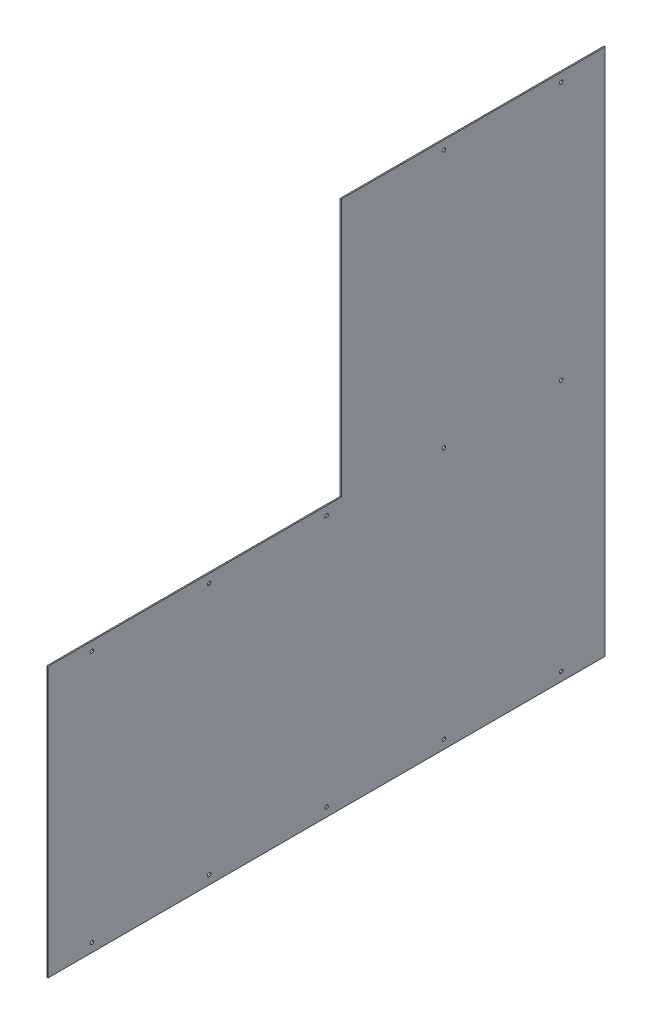
ISO-10303-21;
HEADER;
FILE_DESCRIPTION(('STEP AP214'),'2;1');
FILE_NAME('part.step','',(''),(''),'','','');
FILE_SCHEMA(('AUTOMOTIVE_DESIGN { 1 0 10303 214 1 1 1 1 }'));
ENDSEC;
DATA;
#1=APPLICATION_CONTEXT('core data for automotive mechanical design processes');
#2=APPLICATION_PROTOCOL_DEFINITION('international standard','automotive_design',2000,#1);
#3=PRODUCT_CONTEXT('',#1,'mechanical');
#4=PRODUCT('Part','Part','',(#3));
#5=PRODUCT_RELATED_PRODUCT_CATEGORY('part','',(#4));
#6=PRODUCT_DEFINITION_FORMATION('','',#4);
#7=PRODUCT_DEFINITION_CONTEXT('part definition',#1,'design');
#8=PRODUCT_DEFINITION('design','',#6,#7);
#9=PRODUCT_DEFINITION_SHAPE('','',#8);
#10=(LENGTH_UNIT() NAMED_UNIT(*) SI_UNIT(.MILLI.,.METRE.));
#11=(NAMED_UNIT(*) PLANE_ANGLE_UNIT() SI_UNIT($,.RADIAN.));
#12=(NAMED_UNIT(*) SI_UNIT($,.STERADIAN.) SOLID_ANGLE_UNIT());
#13=UNCERTAINTY_MEASURE_WITH_UNIT(LENGTH_MEASURE(1.E-05),#10,'distance_accuracy_value','');
#14=(GEOMETRIC_REPRESENTATION_CONTEXT(3) GLOBAL_UNCERTAINTY_ASSIGNED_CONTEXT((#13)) GLOBAL_UNIT_ASSIGNED_CONTEXT((#10,
#11,#12)) REPRESENTATION_CONTEXT('',''));
#15=CARTESIAN_POINT('',(0.,0.,0.));
#16=DIRECTION('',(0.,0.,1.));
#17=DIRECTION('',(1.,0.,0.));
#18=AXIS2_PLACEMENT_3D('',#15,#16,#17);
#19=CARTESIAN_POINT('',(2.,230.,475.));
#20=DIRECTION('',(0.,-1.,0.));
#21=DIRECTION('',(0.,0.,-1.));
#22=AXIS2_PLACEMENT_3D('',#19,#20,#21);
#23=PLANE('',#22);
#24=DIRECTION('',(1.,0.,0.));
#25=VECTOR('',#24,1.);
#26=CARTESIAN_POINT('',(0.,230.,-25.));
#27=LINE('',#26,#25);
#28=CARTESIAN_POINT('',(0.,230.,-24.9999999999999));
#29=VERTEX_POINT('',#28);
#30=CARTESIAN_POINT('',(2.,230.,-25.));
#31=VERTEX_POINT('',#30);
#32=EDGE_CURVE('E55',#29,#31,#27,.T.);
#33=ORIENTED_EDGE('',*,*,#32,.F.);
#34=DIRECTION('',(0.,0.,1.));
#35=VECTOR('',#34,1.);
#36=CARTESIAN_POINT('',(0.,230.,475.));
#37=LINE('',#36,#35);
#38=CARTESIAN_POINT('',(0.,230.,475.));
#39=VERTEX_POINT('',#38);
#40=EDGE_CURVE('E110',#29,#39,#37,.T.);
#41=ORIENTED_EDGE('',*,*,#40,.T.);
#42=DIRECTION('',(-1.,0.,0.));
#43=VECTOR('',#42,1.);
#44=CARTESIAN_POINT('',(2.,230.,475.));
#45=LINE('',#44,#43);
#46=CARTESIAN_POINT('',(2.,230.,475.));
#47=VERTEX_POINT('',#46);
#48=EDGE_CURVE('E11',#47,#39,#45,.T.);
#49=ORIENTED_EDGE('',*,*,#48,.F.);
#50=DIRECTION('',(0.,0.,1.));
#51=VECTOR('',#50,1.);
#52=CARTESIAN_POINT('',(2.,230.,475.));
#53=LINE('',#52,#51);
#54=EDGE_CURVE('E84',#31,#47,#53,.T.);
#55=ORIENTED_EDGE('',*,*,#54,.F.);
#56=EDGE_LOOP('',(#33,#41,#49,#55));
#57=FACE_BOUND('',#56,.T.);
#58=ADVANCED_FACE('F39',(#57),#23,.F.);
#59=CARTESIAN_POINT('',(2.,-230.,-475.));
#60=DIRECTION('',(0.,0.,1.));
#61=DIRECTION('',(1.,0.,0.));
#62=AXIS2_PLACEMENT_3D('',#59,#60,#61);
#63=PLANE('',#62);
#64=DIRECTION('',(0.,1.,0.));
#65=VECTOR('',#64,1.);
#66=CARTESIAN_POINT('',(0.,-230.,-475.));
#67=LINE('',#66,#65);
#68=CARTESIAN_POINT('',(0.,-230.,-475.));
#69=VERTEX_POINT('',#68);
#70=CARTESIAN_POINT('',(0.,670.,-475.));
#71=VERTEX_POINT('',#70);
#72=EDGE_CURVE('E101',#69,#71,#67,.T.);
#73=ORIENTED_EDGE('',*,*,#72,.T.);
#74=DIRECTION('',(1.,0.,0.));
#75=VECTOR('',#74,1.);
#76=CARTESIAN_POINT('',(0.,670.,-475.));
#77=LINE('',#76,#75);
#78=CARTESIAN_POINT('',(2.,670.,-475.));
#79=VERTEX_POINT('',#78);
#80=EDGE_CURVE('E104',#71,#79,#77,.T.);
#81=ORIENTED_EDGE('',*,*,#80,.T.);
#82=DIRECTION('',(0.,1.,0.));
#83=VECTOR('',#82,1.);
#84=CARTESIAN_POINT('',(2.,-230.,-475.));
#85=LINE('',#84,#83);
#86=CARTESIAN_POINT('',(2.,-230.,-475.));
#87=VERTEX_POINT('',#86);
#88=EDGE_CURVE('E224',#87,#79,#85,.T.);
#89=ORIENTED_EDGE('',*,*,#88,.F.);
#90=DIRECTION('',(-1.,0.,0.));
#91=VECTOR('',#90,1.);
#92=CARTESIAN_POINT('',(2.,-230.,-475.));
#93=LINE('',#92,#91);
#94=EDGE_CURVE('E106',#87,#69,#93,.T.);
#95=ORIENTED_EDGE('',*,*,#94,.T.);
#96=EDGE_LOOP('',(#73,#81,#89,#95));
#97=FACE_BOUND('',#96,.T.);
#98=ADVANCED_FACE('F41',(#97),#63,.F.);
#99=CARTESIAN_POINT('',(2.,-230.,475.));
#100=DIRECTION('',(0.,0.,-1.));
#101=DIRECTION('',(-1.,0.,0.));
#102=AXIS2_PLACEMENT_3D('',#99,#100,#101);
#103=PLANE('',#102);
#104=DIRECTION('',(0.,-1.,0.));
#105=VECTOR('',#104,1.);
#106=CARTESIAN_POINT('',(0.,-230.,475.));
#107=LINE('',#106,#105);
#108=CARTESIAN_POINT('',(0.,-230.,475.));
#109=VERTEX_POINT('',#108);
#110=EDGE_CURVE('E236',#39,#109,#107,.T.);
#111=ORIENTED_EDGE('',*,*,#110,.T.);
#112=DIRECTION('',(-1.,0.,0.));
#113=VECTOR('',#112,1.);
#114=CARTESIAN_POINT('',(2.,-230.,475.));
#115=LINE('',#114,#113);
#116=CARTESIAN_POINT('',(2.,-230.,475.));
#117=VERTEX_POINT('',#116);
#118=EDGE_CURVE('E48',#117,#109,#115,.T.);
#119=ORIENTED_EDGE('',*,*,#118,.F.);
#120=DIRECTION('',(0.,-1.,0.));
#121=VECTOR('',#120,1.);
#122=CARTESIAN_POINT('',(2.,-230.,475.));
#123=LINE('',#122,#121);
#124=EDGE_CURVE('E229',#47,#117,#123,.T.);
#125=ORIENTED_EDGE('',*,*,#124,.F.);
#126=ORIENTED_EDGE('',*,*,#48,.T.);
#127=EDGE_LOOP('',(#111,#119,#125,#126));
#128=FACE_BOUND('',#127,.T.);
#129=ADVANCED_FACE('F248',(#128),#103,.F.);
#130=CARTESIAN_POINT('',(2.,-230.,475.));
#131=DIRECTION('',(0.,1.,0.));
#132=DIRECTION('',(0.,0.,1.));
#133=AXIS2_PLACEMENT_3D('',#130,#131,#132);
#134=PLANE('',#133);
#135=DIRECTION('',(0.,0.,-1.));
#136=VECTOR('',#135,1.);
#137=CARTESIAN_POINT('',(0.,-230.,475.));
#138=LINE('',#137,#136);
#139=EDGE_CURVE('E80',#109,#69,#138,.T.);
#140=ORIENTED_EDGE('',*,*,#139,.T.);
#141=ORIENTED_EDGE('',*,*,#94,.F.);
#142=DIRECTION('',(0.,0.,-1.));
#143=VECTOR('',#142,1.);
#144=CARTESIAN_POINT('',(2.,-230.,475.));
#145=LINE('',#144,#143);
#146=EDGE_CURVE('E64',#117,#87,#145,.T.);
#147=ORIENTED_EDGE('',*,*,#146,.F.);
#148=ORIENTED_EDGE('',*,*,#118,.T.);
#149=EDGE_LOOP('',(#140,#141,#147,#148));
#150=FACE_BOUND('',#149,.T.);
#151=ADVANCED_FACE('F244',(#150),#134,.F.);
#152=CARTESIAN_POINT('',(2.,0.,0.));
#153=DIRECTION('',(-1.,0.,0.));
#154=DIRECTION('',(0.,0.,1.));
#155=AXIS2_PLACEMENT_3D('',#152,#153,#154);
#156=PLANE('',#155);
#157=CARTESIAN_POINT('',(2.,-215.,400.));
#158=DIRECTION('',(1.,0.,0.));
#159=DIRECTION('',(0.,0.,1.));
#160=AXIS2_PLACEMENT_3D('',#157,#158,#159);
#161=CIRCLE('',#160,2.99999999999999);
#162=CARTESIAN_POINT('',(2.,-215.,403.));
#163=VERTEX_POINT('',#162);
#164=EDGE_CURVE('E143',#163,#163,#161,.T.);
#165=ORIENTED_EDGE('',*,*,#164,.F.);
#166=EDGE_LOOP('',(#165));
#167=FACE_BOUND('',#166,.T.);
#168=CARTESIAN_POINT('',(2.,-215.,-400.));
#169=DIRECTION('',(1.,0.,0.));
#170=DIRECTION('',(0.,0.,1.));
#171=AXIS2_PLACEMENT_3D('',#168,#169,#170);
#172=CIRCLE('',#171,2.99999999999999);
#173=CARTESIAN_POINT('',(2.,-215.,-397.));
#174=VERTEX_POINT('',#173);
#175=EDGE_CURVE('E201',#174,#174,#172,.T.);
#176=ORIENTED_EDGE('',*,*,#175,.F.);
#177=EDGE_LOOP('',(#176));
#178=FACE_BOUND('',#177,.T.);
#179=CARTESIAN_POINT('',(2.,-215.,1.11022302462516E-13));
#180=DIRECTION('',(1.,0.,0.));
#181=DIRECTION('',(0.,0.,1.));
#182=AXIS2_PLACEMENT_3D('',#179,#180,#181);
#183=CIRCLE('',#182,3.);
#184=CARTESIAN_POINT('',(2.,-215.,3.00000000000011));
#185=VERTEX_POINT('',#184);
#186=EDGE_CURVE('E184',#185,#185,#183,.T.);
#187=ORIENTED_EDGE('',*,*,#186,.F.);
#188=EDGE_LOOP('',(#187));
#189=FACE_BOUND('',#188,.T.);
#190=CARTESIAN_POINT('',(2.,-215.,-200.));
#191=DIRECTION('',(1.,0.,0.));
#192=DIRECTION('',(0.,0.,1.));
#193=AXIS2_PLACEMENT_3D('',#190,#191,#192);
#194=CIRCLE('',#193,2.99999999999999);
#195=CARTESIAN_POINT('',(2.,-215.,-197.));
#196=VERTEX_POINT('',#195);
#197=EDGE_CURVE('E185',#196,#196,#194,.T.);
#198=ORIENTED_EDGE('',*,*,#197,.F.);
#199=EDGE_LOOP('',(#198));
#200=FACE_BOUND('',#199,.T.);
#201=CARTESIAN_POINT('',(2.,-215.,200.));
#202=DIRECTION('',(1.,0.,0.));
#203=DIRECTION('',(0.,0.,1.));
#204=AXIS2_PLACEMENT_3D('',#201,#202,#203);
#205=CIRCLE('',#204,2.99999999999999);
#206=CARTESIAN_POINT('',(2.,-215.,203.));
#207=VERTEX_POINT('',#206);
#208=EDGE_CURVE('E193',#207,#207,#205,.T.);
#209=ORIENTED_EDGE('',*,*,#208,.F.);
#210=EDGE_LOOP('',(#209));
#211=FACE_BOUND('',#210,.T.);
#212=CARTESIAN_POINT('',(2.,215.,-400.));
#213=DIRECTION('',(1.,0.,0.));
#214=DIRECTION('',(0.,0.,-1.));
#215=AXIS2_PLACEMENT_3D('',#212,#213,#214);
#216=CIRCLE('',#215,2.99999999999999);
#217=CARTESIAN_POINT('',(2.,215.,-403.));
#218=VERTEX_POINT('',#217);
#219=EDGE_CURVE('E175',#218,#218,#216,.T.);
#220=ORIENTED_EDGE('',*,*,#219,.F.);
#221=EDGE_LOOP('',(#220));
#222=FACE_BOUND('',#221,.T.);
#223=CARTESIAN_POINT('',(2.,215.,-200.));
#224=DIRECTION('',(1.,0.,0.));
#225=DIRECTION('',(0.,0.,-1.));
#226=AXIS2_PLACEMENT_3D('',#223,#224,#225);
#227=CIRCLE('',#226,2.99999999999999);
#228=CARTESIAN_POINT('',(2.,215.,-203.));
#229=VERTEX_POINT('',#228);
#230=EDGE_CURVE('E167',#229,#229,#227,.T.);
#231=ORIENTED_EDGE('',*,*,#230,.F.);
#232=EDGE_LOOP('',(#231));
#233=FACE_BOUND('',#232,.T.);
#234=CARTESIAN_POINT('',(2.,215.,-1.11022302462516E-13));
#235=DIRECTION('',(1.,0.,0.));
#236=DIRECTION('',(0.,0.,-1.));
#237=AXIS2_PLACEMENT_3D('',#234,#235,#236);
#238=CIRCLE('',#237,3.);
#239=CARTESIAN_POINT('',(2.,215.,-3.00000000000011));
#240=VERTEX_POINT('',#239);
#241=EDGE_CURVE('E159',#240,#240,#238,.T.);
#242=ORIENTED_EDGE('',*,*,#241,.F.);
#243=EDGE_LOOP('',(#242));
#244=FACE_BOUND('',#243,.T.);
#245=CARTESIAN_POINT('',(2.,215.,200.));
#246=DIRECTION('',(1.,0.,0.));
#247=DIRECTION('',(0.,0.,-1.));
#248=AXIS2_PLACEMENT_3D('',#245,#246,#247);
#249=CIRCLE('',#248,2.99999999999999);
#250=CARTESIAN_POINT('',(2.,215.,197.));
#251=VERTEX_POINT('',#250);
#252=EDGE_CURVE('E151',#251,#251,#249,.T.);
#253=ORIENTED_EDGE('',*,*,#252,.F.);
#254=EDGE_LOOP('',(#253));
#255=FACE_BOUND('',#254,.T.);
#256=CARTESIAN_POINT('',(2.,215.,400.));
#257=DIRECTION('',(1.,0.,0.));
#258=DIRECTION('',(0.,0.,-1.));
#259=AXIS2_PLACEMENT_3D('',#256,#257,#258);
#260=CIRCLE('',#259,2.99999999999999);
#261=CARTESIAN_POINT('',(2.,215.,397.));
#262=VERTEX_POINT('',#261);
#263=EDGE_CURVE('E150',#262,#262,#260,.T.);
#264=ORIENTED_EDGE('',*,*,#263,.F.);
#265=EDGE_LOOP('',(#264));
#266=FACE_BOUND('',#265,.T.);
#267=ORIENTED_EDGE('',*,*,#88,.T.);
#268=DIRECTION('',(0.,0.,1.));
#269=VECTOR('',#268,1.);
#270=CARTESIAN_POINT('',(2.,670.,-25.));
#271=LINE('',#270,#269);
#272=CARTESIAN_POINT('',(2.,670.,-25.));
#273=VERTEX_POINT('',#272);
#274=EDGE_CURVE('E118',#79,#273,#271,.T.);
#275=ORIENTED_EDGE('',*,*,#274,.T.);
#276=DIRECTION('',(0.,-1.,0.));
#277=VECTOR('',#276,1.);
#278=CARTESIAN_POINT('',(2.,230.,-25.));
#279=LINE('',#278,#277);
#280=EDGE_CURVE('E128',#273,#31,#279,.T.);
#281=ORIENTED_EDGE('',*,*,#280,.T.);
#282=ORIENTED_EDGE('',*,*,#54,.T.);
#283=ORIENTED_EDGE('',*,*,#124,.T.);
#284=ORIENTED_EDGE('',*,*,#146,.T.);
#285=EDGE_LOOP('',(#267,#275,#281,#282,#283,#284));
#286=FACE_BOUND('',#285,.T.);
#287=CARTESIAN_POINT('',(2.,655.,-200.));
#288=DIRECTION('',(1.,0.,0.));
#289=DIRECTION('',(0.,0.,-1.));
#290=AXIS2_PLACEMENT_3D('',#287,#288,#289);
#291=CIRCLE('',#290,2.99999999999999);
#292=CARTESIAN_POINT('',(2.,655.,-203.));
#293=VERTEX_POINT('',#292);
#294=EDGE_CURVE('E260',#293,#293,#291,.T.);
#295=ORIENTED_EDGE('',*,*,#294,.F.);
#296=EDGE_LOOP('',(#295));
#297=FACE_BOUND('',#296,.T.);
#298=CARTESIAN_POINT('',(2.,655.,-400.));
#299=DIRECTION('',(1.,0.,0.));
#300=DIRECTION('',(0.,0.,-1.));
#301=AXIS2_PLACEMENT_3D('',#298,#299,#300);
#302=CIRCLE('',#301,2.99999999999999);
#303=CARTESIAN_POINT('',(2.,655.,-403.));
#304=VERTEX_POINT('',#303);
#305=EDGE_CURVE('E135',#304,#304,#302,.T.);
#306=ORIENTED_EDGE('',*,*,#305,.F.);
#307=EDGE_LOOP('',(#306));
#308=FACE_BOUND('',#307,.T.);
#309=ADVANCED_FACE('F252',(#167,#178,#189,#200,#211,#222,#233,#244,#255,#266,#286,#297,#308),
#156,.F.);
#310=CARTESIAN_POINT('',(0.,0.,0.));
#311=DIRECTION('',(-1.,0.,0.));
#312=DIRECTION('',(0.,0.,1.));
#313=AXIS2_PLACEMENT_3D('',#310,#311,#312);
#314=PLANE('',#313);
#315=CARTESIAN_POINT('',(0.,-215.,400.));
#316=DIRECTION('',(1.,0.,0.));
#317=DIRECTION('',(0.,0.,1.));
#318=AXIS2_PLACEMENT_3D('',#315,#316,#317);
#319=CIRCLE('',#318,2.99999999999999);
#320=CARTESIAN_POINT('',(0.,-215.,403.));
#321=VERTEX_POINT('',#320);
#322=EDGE_CURVE('E197',#321,#321,#319,.T.);
#323=ORIENTED_EDGE('',*,*,#322,.T.);
#324=EDGE_LOOP('',(#323));
#325=FACE_BOUND('',#324,.T.);
#326=CARTESIAN_POINT('',(0.,-215.,-400.));
#327=DIRECTION('',(1.,0.,0.));
#328=DIRECTION('',(0.,0.,1.));
#329=AXIS2_PLACEMENT_3D('',#326,#327,#328);
#330=CIRCLE('',#329,2.99999999999999);
#331=CARTESIAN_POINT('',(0.,-215.,-397.));
#332=VERTEX_POINT('',#331);
#333=EDGE_CURVE('E179',#332,#332,#330,.T.);
#334=ORIENTED_EDGE('',*,*,#333,.T.);
#335=EDGE_LOOP('',(#334));
#336=FACE_BOUND('',#335,.T.);
#337=CARTESIAN_POINT('',(0.,-215.,1.11022302462516E-13));
#338=DIRECTION('',(1.,0.,0.));
#339=DIRECTION('',(0.,0.,1.));
#340=AXIS2_PLACEMENT_3D('',#337,#338,#339);
#341=CIRCLE('',#340,3.);
#342=CARTESIAN_POINT('',(0.,-215.,3.00000000000011));
#343=VERTEX_POINT('',#342);
#344=EDGE_CURVE('E205',#343,#343,#341,.T.);
#345=ORIENTED_EDGE('',*,*,#344,.T.);
#346=EDGE_LOOP('',(#345));
#347=FACE_BOUND('',#346,.T.);
#348=CARTESIAN_POINT('',(0.,-215.,-200.));
#349=DIRECTION('',(1.,0.,0.));
#350=DIRECTION('',(0.,0.,1.));
#351=AXIS2_PLACEMENT_3D('',#348,#349,#350);
#352=CIRCLE('',#351,2.99999999999999);
#353=CARTESIAN_POINT('',(0.,-215.,-197.));
#354=VERTEX_POINT('',#353);
#355=EDGE_CURVE('E180',#354,#354,#352,.T.);
#356=ORIENTED_EDGE('',*,*,#355,.T.);
#357=EDGE_LOOP('',(#356));
#358=FACE_BOUND('',#357,.T.);
#359=CARTESIAN_POINT('',(0.,-215.,200.));
#360=DIRECTION('',(1.,0.,0.));
#361=DIRECTION('',(0.,0.,1.));
#362=AXIS2_PLACEMENT_3D('',#359,#360,#361);
#363=CIRCLE('',#362,2.99999999999999);
#364=CARTESIAN_POINT('',(0.,-215.,203.));
#365=VERTEX_POINT('',#364);
#366=EDGE_CURVE('E189',#365,#365,#363,.T.);
#367=ORIENTED_EDGE('',*,*,#366,.T.);
#368=EDGE_LOOP('',(#367));
#369=FACE_BOUND('',#368,.T.);
#370=CARTESIAN_POINT('',(0.,215.,-400.));
#371=DIRECTION('',(1.,0.,0.));
#372=DIRECTION('',(0.,0.,-1.));
#373=AXIS2_PLACEMENT_3D('',#370,#371,#372);
#374=CIRCLE('',#373,2.99999999999999);
#375=CARTESIAN_POINT('',(0.,215.,-403.));
#376=VERTEX_POINT('',#375);
#377=EDGE_CURVE('E171',#376,#376,#374,.T.);
#378=ORIENTED_EDGE('',*,*,#377,.T.);
#379=EDGE_LOOP('',(#378));
#380=FACE_BOUND('',#379,.T.);
#381=CARTESIAN_POINT('',(0.,215.,-200.));
#382=DIRECTION('',(1.,0.,0.));
#383=DIRECTION('',(0.,0.,-1.));
#384=AXIS2_PLACEMENT_3D('',#381,#382,#383);
#385=CIRCLE('',#384,2.99999999999999);
#386=CARTESIAN_POINT('',(0.,215.,-203.));
#387=VERTEX_POINT('',#386);
#388=EDGE_CURVE('E163',#387,#387,#385,.T.);
#389=ORIENTED_EDGE('',*,*,#388,.T.);
#390=EDGE_LOOP('',(#389));
#391=FACE_BOUND('',#390,.T.);
#392=CARTESIAN_POINT('',(0.,215.,-1.11022302462516E-13));
#393=DIRECTION('',(1.,0.,0.));
#394=DIRECTION('',(0.,0.,-1.));
#395=AXIS2_PLACEMENT_3D('',#392,#393,#394);
#396=CIRCLE('',#395,3.);
#397=CARTESIAN_POINT('',(0.,215.,-3.00000000000011));
#398=VERTEX_POINT('',#397);
#399=EDGE_CURVE('E155',#398,#398,#396,.T.);
#400=ORIENTED_EDGE('',*,*,#399,.T.);
#401=EDGE_LOOP('',(#400));
#402=FACE_BOUND('',#401,.T.);
#403=CARTESIAN_POINT('',(0.,215.,200.));
#404=DIRECTION('',(1.,0.,0.));
#405=DIRECTION('',(0.,0.,-1.));
#406=AXIS2_PLACEMENT_3D('',#403,#404,#405);
#407=CIRCLE('',#406,2.99999999999999);
#408=CARTESIAN_POINT('',(0.,215.,197.));
#409=VERTEX_POINT('',#408);
#410=EDGE_CURVE('E146',#409,#409,#407,.T.);
#411=ORIENTED_EDGE('',*,*,#410,.T.);
#412=EDGE_LOOP('',(#411));
#413=FACE_BOUND('',#412,.T.);
#414=CARTESIAN_POINT('',(0.,215.,400.));
#415=DIRECTION('',(1.,0.,0.));
#416=DIRECTION('',(0.,0.,-1.));
#417=AXIS2_PLACEMENT_3D('',#414,#415,#416);
#418=CIRCLE('',#417,2.99999999999999);
#419=CARTESIAN_POINT('',(0.,215.,397.));
#420=VERTEX_POINT('',#419);
#421=EDGE_CURVE('E111',#420,#420,#418,.T.);
#422=ORIENTED_EDGE('',*,*,#421,.T.);
#423=EDGE_LOOP('',(#422));
#424=FACE_BOUND('',#423,.T.);
#425=ORIENTED_EDGE('',*,*,#72,.F.);
#426=ORIENTED_EDGE('',*,*,#139,.F.);
#427=ORIENTED_EDGE('',*,*,#110,.F.);
#428=ORIENTED_EDGE('',*,*,#40,.F.);
#429=DIRECTION('',(0.,-1.,0.));
#430=VECTOR('',#429,1.);
#431=CARTESIAN_POINT('',(0.,230.,-25.));
#432=LINE('',#431,#430);
#433=CARTESIAN_POINT('',(0.,670.,-25.));
#434=VERTEX_POINT('',#433);
#435=EDGE_CURVE('E121',#434,#29,#432,.T.);
#436=ORIENTED_EDGE('',*,*,#435,.F.);
#437=DIRECTION('',(0.,0.,1.));
#438=VECTOR('',#437,1.);
#439=CARTESIAN_POINT('',(0.,670.,-25.));
#440=LINE('',#439,#438);
#441=EDGE_CURVE('E116',#71,#434,#440,.T.);
#442=ORIENTED_EDGE('',*,*,#441,.F.);
#443=EDGE_LOOP('',(#425,#426,#427,#428,#436,#442));
#444=FACE_BOUND('',#443,.T.);
#445=CARTESIAN_POINT('',(0.,655.,-200.));
#446=DIRECTION('',(1.,0.,0.));
#447=DIRECTION('',(0.,0.,-1.));
#448=AXIS2_PLACEMENT_3D('',#445,#446,#447);
#449=CIRCLE('',#448,2.99999999999999);
#450=CARTESIAN_POINT('',(0.,655.,-203.));
#451=VERTEX_POINT('',#450);
#452=EDGE_CURVE('E265',#451,#451,#449,.T.);
#453=ORIENTED_EDGE('',*,*,#452,.T.);
#454=EDGE_LOOP('',(#453));
#455=FACE_BOUND('',#454,.T.);
#456=CARTESIAN_POINT('',(0.,655.,-400.));
#457=DIRECTION('',(1.,0.,0.));
#458=DIRECTION('',(0.,0.,-1.));
#459=AXIS2_PLACEMENT_3D('',#456,#457,#458);
#460=CIRCLE('',#459,2.99999999999999);
#461=CARTESIAN_POINT('',(0.,655.,-403.));
#462=VERTEX_POINT('',#461);
#463=EDGE_CURVE('E139',#462,#462,#460,.T.);
#464=ORIENTED_EDGE('',*,*,#463,.T.);
#465=EDGE_LOOP('',(#464));
#466=FACE_BOUND('',#465,.T.);
#467=ADVANCED_FACE('F124',(#325,#336,#347,#358,#369,#380,#391,#402,#413,#424,#444,#455,#466),
#314,.T.);
#468=CARTESIAN_POINT('',(0.,215.,400.));
#469=DIRECTION('',(1.,0.,0.));
#470=DIRECTION('',(0.,0.,-1.));
#471=AXIS2_PLACEMENT_3D('',#468,#469,#470);
#472=CYLINDRICAL_SURFACE('',#471,2.99999999999999);
#473=ORIENTED_EDGE('',*,*,#421,.F.);
#474=EDGE_LOOP('',(#473));
#475=FACE_BOUND('',#474,.T.);
#476=ORIENTED_EDGE('',*,*,#263,.T.);
#477=EDGE_LOOP('',(#476));
#478=FACE_BOUND('',#477,.T.);
#479=ADVANCED_FACE('F295',(#475,#478),#472,.F.);
#480=CARTESIAN_POINT('',(0.,215.,200.));
#481=DIRECTION('',(1.,0.,0.));
#482=DIRECTION('',(0.,0.,-1.));
#483=AXIS2_PLACEMENT_3D('',#480,#481,#482);
#484=CYLINDRICAL_SURFACE('',#483,2.99999999999999);
#485=ORIENTED_EDGE('',*,*,#410,.F.);
#486=EDGE_LOOP('',(#485));
#487=FACE_BOUND('',#486,.T.);
#488=ORIENTED_EDGE('',*,*,#252,.T.);
#489=EDGE_LOOP('',(#488));
#490=FACE_BOUND('',#489,.T.);
#491=ADVANCED_FACE('F300',(#487,#490),#484,.F.);
#492=CARTESIAN_POINT('',(0.,215.,-1.11022302462516E-13));
#493=DIRECTION('',(1.,0.,0.));
#494=DIRECTION('',(0.,0.,-1.));
#495=AXIS2_PLACEMENT_3D('',#492,#493,#494);
#496=CYLINDRICAL_SURFACE('',#495,3.);
#497=ORIENTED_EDGE('',*,*,#399,.F.);
#498=EDGE_LOOP('',(#497));
#499=FACE_BOUND('',#498,.T.);
#500=ORIENTED_EDGE('',*,*,#241,.T.);
#501=EDGE_LOOP('',(#500));
#502=FACE_BOUND('',#501,.T.);
#503=ADVANCED_FACE('F329',(#499,#502),#496,.F.);
#504=CARTESIAN_POINT('',(0.,215.,-200.));
#505=DIRECTION('',(1.,0.,0.));
#506=DIRECTION('',(0.,0.,-1.));
#507=AXIS2_PLACEMENT_3D('',#504,#505,#506);
#508=CYLINDRICAL_SURFACE('',#507,2.99999999999999);
#509=ORIENTED_EDGE('',*,*,#388,.F.);
#510=EDGE_LOOP('',(#509));
#511=FACE_BOUND('',#510,.T.);
#512=ORIENTED_EDGE('',*,*,#230,.T.);
#513=EDGE_LOOP('',(#512));
#514=FACE_BOUND('',#513,.T.);
#515=ADVANCED_FACE('F325',(#511,#514),#508,.F.);
#516=CARTESIAN_POINT('',(0.,215.,-400.));
#517=DIRECTION('',(1.,0.,0.));
#518=DIRECTION('',(0.,0.,-1.));
#519=AXIS2_PLACEMENT_3D('',#516,#517,#518);
#520=CYLINDRICAL_SURFACE('',#519,2.99999999999999);
#521=ORIENTED_EDGE('',*,*,#377,.F.);
#522=EDGE_LOOP('',(#521));
#523=FACE_BOUND('',#522,.T.);
#524=ORIENTED_EDGE('',*,*,#219,.T.);
#525=EDGE_LOOP('',(#524));
#526=FACE_BOUND('',#525,.T.);
#527=ADVANCED_FACE('F318',(#523,#526),#520,.F.);
#528=CARTESIAN_POINT('',(0.,-215.,200.));
#529=DIRECTION('',(1.,0.,0.));
#530=DIRECTION('',(0.,0.,-1.));
#531=AXIS2_PLACEMENT_3D('',#528,#529,#530);
#532=CYLINDRICAL_SURFACE('',#531,2.99999999999999);
#533=ORIENTED_EDGE('',*,*,#366,.F.);
#534=EDGE_LOOP('',(#533));
#535=FACE_BOUND('',#534,.T.);
#536=ORIENTED_EDGE('',*,*,#208,.T.);
#537=EDGE_LOOP('',(#536));
#538=FACE_BOUND('',#537,.T.);
#539=ADVANCED_FACE('F315',(#535,#538),#532,.F.);
#540=CARTESIAN_POINT('',(0.,-215.,-200.));
#541=DIRECTION('',(1.,0.,0.));
#542=DIRECTION('',(0.,0.,-1.));
#543=AXIS2_PLACEMENT_3D('',#540,#541,#542);
#544=CYLINDRICAL_SURFACE('',#543,2.99999999999999);
#545=ORIENTED_EDGE('',*,*,#355,.F.);
#546=EDGE_LOOP('',(#545));
#547=FACE_BOUND('',#546,.T.);
#548=ORIENTED_EDGE('',*,*,#197,.T.);
#549=EDGE_LOOP('',(#548));
#550=FACE_BOUND('',#549,.T.);
#551=ADVANCED_FACE('F310',(#547,#550),#544,.F.);
#552=CARTESIAN_POINT('',(0.,-215.,1.11022302462516E-13));
#553=DIRECTION('',(1.,0.,0.));
#554=DIRECTION('',(0.,0.,-1.));
#555=AXIS2_PLACEMENT_3D('',#552,#553,#554);
#556=CYLINDRICAL_SURFACE('',#555,3.);
#557=ORIENTED_EDGE('',*,*,#344,.F.);
#558=EDGE_LOOP('',(#557));
#559=FACE_BOUND('',#558,.T.);
#560=ORIENTED_EDGE('',*,*,#186,.T.);
#561=EDGE_LOOP('',(#560));
#562=FACE_BOUND('',#561,.T.);
#563=ADVANCED_FACE('F307',(#559,#562),#556,.F.);
#564=CARTESIAN_POINT('',(0.,-215.,-400.));
#565=DIRECTION('',(1.,0.,0.));
#566=DIRECTION('',(0.,0.,-1.));
#567=AXIS2_PLACEMENT_3D('',#564,#565,#566);
#568=CYLINDRICAL_SURFACE('',#567,2.99999999999999);
#569=ORIENTED_EDGE('',*,*,#333,.F.);
#570=EDGE_LOOP('',(#569));
#571=FACE_BOUND('',#570,.T.);
#572=ORIENTED_EDGE('',*,*,#175,.T.);
#573=EDGE_LOOP('',(#572));
#574=FACE_BOUND('',#573,.T.);
#575=ADVANCED_FACE('F305',(#571,#574),#568,.F.);
#576=CARTESIAN_POINT('',(0.,-215.,400.));
#577=DIRECTION('',(1.,0.,0.));
#578=DIRECTION('',(0.,0.,-1.));
#579=AXIS2_PLACEMENT_3D('',#576,#577,#578);
#580=CYLINDRICAL_SURFACE('',#579,2.99999999999999);
#581=ORIENTED_EDGE('',*,*,#322,.F.);
#582=EDGE_LOOP('',(#581));
#583=FACE_BOUND('',#582,.T.);
#584=ORIENTED_EDGE('',*,*,#164,.T.);
#585=EDGE_LOOP('',(#584));
#586=FACE_BOUND('',#585,.T.);
#587=ADVANCED_FACE('F302',(#583,#586),#580,.F.);
#588=CARTESIAN_POINT('',(0.,230.,-25.));
#589=DIRECTION('',(0.,0.,1.));
#590=DIRECTION('',(0.,-1.,0.));
#591=AXIS2_PLACEMENT_3D('',#588,#589,#590);
#592=PLANE('',#591);
#593=ORIENTED_EDGE('',*,*,#280,.F.);
#594=DIRECTION('',(1.,0.,0.));
#595=VECTOR('',#594,1.);
#596=CARTESIAN_POINT('',(0.,670.,-25.));
#597=LINE('',#596,#595);
#598=EDGE_CURVE('E120',#434,#273,#597,.T.);
#599=ORIENTED_EDGE('',*,*,#598,.F.);
#600=ORIENTED_EDGE('',*,*,#435,.T.);
#601=ORIENTED_EDGE('',*,*,#32,.T.);
#602=EDGE_LOOP('',(#593,#599,#600,#601));
#603=FACE_BOUND('',#602,.T.);
#604=ADVANCED_FACE('F251',(#603),#592,.T.);
#605=CARTESIAN_POINT('',(0.,670.,-25.));
#606=DIRECTION('',(0.,1.,0.));
#607=DIRECTION('',(0.,0.,1.));
#608=AXIS2_PLACEMENT_3D('',#605,#606,#607);
#609=PLANE('',#608);
#610=ORIENTED_EDGE('',*,*,#274,.F.);
#611=ORIENTED_EDGE('',*,*,#80,.F.);
#612=ORIENTED_EDGE('',*,*,#441,.T.);
#613=ORIENTED_EDGE('',*,*,#598,.T.);
#614=EDGE_LOOP('',(#610,#611,#612,#613));
#615=FACE_BOUND('',#614,.T.);
#616=ADVANCED_FACE('F115',(#615),#609,.T.);
#617=CARTESIAN_POINT('',(0.,655.,-400.));
#618=DIRECTION('',(1.,0.,0.));
#619=DIRECTION('',(0.,0.,-1.));
#620=AXIS2_PLACEMENT_3D('',#617,#618,#619);
#621=CYLINDRICAL_SURFACE('',#620,2.99999999999999);
#622=ORIENTED_EDGE('',*,*,#463,.F.);
#623=EDGE_LOOP('',(#622));
#624=FACE_BOUND('',#623,.T.);
#625=ORIENTED_EDGE('',*,*,#305,.T.);
#626=EDGE_LOOP('',(#625));
#627=FACE_BOUND('',#626,.T.);
#628=ADVANCED_FACE('F277',(#624,#627),#621,.F.);
#629=CARTESIAN_POINT('',(0.,655.,-200.));
#630=DIRECTION('',(1.,0.,0.));
#631=DIRECTION('',(0.,0.,-1.));
#632=AXIS2_PLACEMENT_3D('',#629,#630,#631);
#633=CYLINDRICAL_SURFACE('',#632,2.99999999999999);
#634=ORIENTED_EDGE('',*,*,#452,.F.);
#635=EDGE_LOOP('',(#634));
#636=FACE_BOUND('',#635,.T.);
#637=ORIENTED_EDGE('',*,*,#294,.T.);
#638=EDGE_LOOP('',(#637));
#639=FACE_BOUND('',#638,.T.);
#640=ADVANCED_FACE('F275',(#636,#639),#633,.F.);
#641=CLOSED_SHELL('',(#58,#98,#129,#151,#309,#467,#479,#491,#503,#515,#527,#539,#551,#563,#575,
#587,#604,#616,#628,#640));
#642=MANIFOLD_SOLID_BREP('B2',#641);
#643=ADVANCED_BREP_SHAPE_REPRESENTATION('',(#18,#642),#14);
#644=SHAPE_DEFINITION_REPRESENTATION(#9,#643);
ENDSEC;
END-ISO-10303-21;
